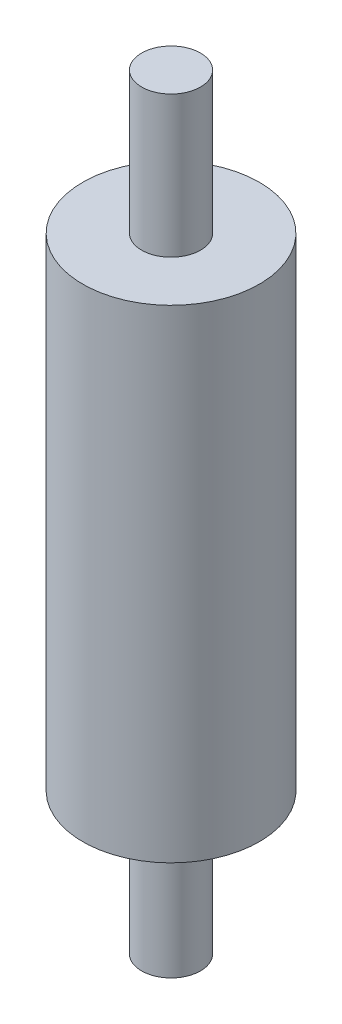
ISO-10303-21;
HEADER;
FILE_DESCRIPTION(('STEP AP214'),'2;1');
FILE_NAME('part.step','',(''),(''),'','','');
FILE_SCHEMA(('AUTOMOTIVE_DESIGN { 1 0 10303 214 1 1 1 1 }'));
ENDSEC;
DATA;
#1=APPLICATION_CONTEXT('core data for automotive mechanical design processes');
#2=APPLICATION_PROTOCOL_DEFINITION('international standard','automotive_design',2000,#1);
#3=PRODUCT_CONTEXT('',#1,'mechanical');
#4=PRODUCT('Part','Part','',(#3));
#5=PRODUCT_RELATED_PRODUCT_CATEGORY('part','',(#4));
#6=PRODUCT_DEFINITION_FORMATION('','',#4);
#7=PRODUCT_DEFINITION_CONTEXT('part definition',#1,'design');
#8=PRODUCT_DEFINITION('design','',#6,#7);
#9=PRODUCT_DEFINITION_SHAPE('','',#8);
#10=(LENGTH_UNIT() NAMED_UNIT(*) SI_UNIT(.MILLI.,.METRE.));
#11=(NAMED_UNIT(*) PLANE_ANGLE_UNIT() SI_UNIT($,.RADIAN.));
#12=(NAMED_UNIT(*) SI_UNIT($,.STERADIAN.) SOLID_ANGLE_UNIT());
#13=UNCERTAINTY_MEASURE_WITH_UNIT(LENGTH_MEASURE(1.E-05),#10,'distance_accuracy_value','');
#14=(GEOMETRIC_REPRESENTATION_CONTEXT(3) GLOBAL_UNCERTAINTY_ASSIGNED_CONTEXT((#13)) GLOBAL_UNIT_ASSIGNED_CONTEXT((#10,
#11,#12)) REPRESENTATION_CONTEXT('',''));
#15=CARTESIAN_POINT('',(0.,0.,0.));
#16=DIRECTION('',(0.,0.,1.));
#17=DIRECTION('',(1.,0.,0.));
#18=AXIS2_PLACEMENT_3D('',#15,#16,#17);
#19=CARTESIAN_POINT('',(0.,-32.5,0.));
#20=DIRECTION('',(0.,-1.,0.));
#21=DIRECTION('',(0.,0.,-1.));
#22=AXIS2_PLACEMENT_3D('',#19,#20,#21);
#23=PLANE('',#22);
#24=CARTESIAN_POINT('',(0.,-32.5,0.));
#25=DIRECTION('',(0.,-1.,0.));
#26=DIRECTION('',(0.,0.,-1.));
#27=AXIS2_PLACEMENT_3D('',#24,#25,#26);
#28=CIRCLE('',#27,2.5);
#29=CARTESIAN_POINT('',(0.,-32.5,-2.5));
#30=VERTEX_POINT('',#29);
#31=EDGE_CURVE('E10',#30,#30,#28,.T.);
#32=ORIENTED_EDGE('',*,*,#31,.T.);
#33=EDGE_LOOP('',(#32));
#34=FACE_BOUND('',#33,.T.);
#35=ADVANCED_FACE('F35',(#34),#23,.T.);
#36=CARTESIAN_POINT('',(0.,0.,0.));
#37=DIRECTION('',(0.,-1.,0.));
#38=DIRECTION('',(0.,0.,-1.));
#39=AXIS2_PLACEMENT_3D('',#36,#37,#38);
#40=CYLINDRICAL_SURFACE('',#39,2.5);
#41=CARTESIAN_POINT('',(0.,-20.5,0.));
#42=DIRECTION('',(0.,-1.,0.));
#43=DIRECTION('',(0.,0.,-1.));
#44=AXIS2_PLACEMENT_3D('',#41,#42,#43);
#45=CIRCLE('',#44,2.5);
#46=CARTESIAN_POINT('',(0.,-20.5,-2.5));
#47=VERTEX_POINT('',#46);
#48=EDGE_CURVE('E41',#47,#47,#45,.T.);
#49=ORIENTED_EDGE('',*,*,#48,.T.);
#50=EDGE_LOOP('',(#49));
#51=FACE_BOUND('',#50,.T.);
#52=ORIENTED_EDGE('',*,*,#31,.F.);
#53=EDGE_LOOP('',(#52));
#54=FACE_BOUND('',#53,.T.);
#55=ADVANCED_FACE('F73',(#51,#54),#40,.T.);
#56=CARTESIAN_POINT('',(0.,-20.5,-2.5));
#57=DIRECTION('',(0.,-1.,0.));
#58=DIRECTION('',(0.,0.,-1.));
#59=AXIS2_PLACEMENT_3D('',#56,#57,#58);
#60=PLANE('',#59);
#61=CARTESIAN_POINT('',(0.,-20.5,0.));
#62=DIRECTION('',(0.,-1.,0.));
#63=DIRECTION('',(0.,0.,-1.));
#64=AXIS2_PLACEMENT_3D('',#61,#62,#63);
#65=CIRCLE('',#64,7.5);
#66=CARTESIAN_POINT('',(0.,-20.5,-7.5));
#67=VERTEX_POINT('',#66);
#68=EDGE_CURVE('E45',#67,#67,#65,.T.);
#69=ORIENTED_EDGE('',*,*,#68,.T.);
#70=EDGE_LOOP('',(#69));
#71=FACE_BOUND('',#70,.T.);
#72=ORIENTED_EDGE('',*,*,#48,.F.);
#73=EDGE_LOOP('',(#72));
#74=FACE_BOUND('',#73,.T.);
#75=ADVANCED_FACE('F77',(#71,#74),#60,.T.);
#76=CARTESIAN_POINT('',(0.,0.,0.));
#77=DIRECTION('',(0.,-1.,0.));
#78=DIRECTION('',(0.,0.,-1.));
#79=AXIS2_PLACEMENT_3D('',#76,#77,#78);
#80=CYLINDRICAL_SURFACE('',#79,7.5);
#81=CARTESIAN_POINT('',(0.,20.5,0.));
#82=DIRECTION('',(0.,-1.,0.));
#83=DIRECTION('',(0.,0.,-1.));
#84=AXIS2_PLACEMENT_3D('',#81,#82,#83);
#85=CIRCLE('',#84,7.5);
#86=CARTESIAN_POINT('',(0.,20.5,-7.5));
#87=VERTEX_POINT('',#86);
#88=EDGE_CURVE('E49',#87,#87,#85,.T.);
#89=ORIENTED_EDGE('',*,*,#88,.T.);
#90=EDGE_LOOP('',(#89));
#91=FACE_BOUND('',#90,.T.);
#92=ORIENTED_EDGE('',*,*,#68,.F.);
#93=EDGE_LOOP('',(#92));
#94=FACE_BOUND('',#93,.T.);
#95=ADVANCED_FACE('F81',(#91,#94),#80,.T.);
#96=CARTESIAN_POINT('',(0.,20.5,-7.5));
#97=DIRECTION('',(0.,1.,0.));
#98=DIRECTION('',(0.,0.,1.));
#99=AXIS2_PLACEMENT_3D('',#96,#97,#98);
#100=PLANE('',#99);
#101=CARTESIAN_POINT('',(0.,20.5,0.));
#102=DIRECTION('',(0.,-1.,0.));
#103=DIRECTION('',(0.,0.,-1.));
#104=AXIS2_PLACEMENT_3D('',#101,#102,#103);
#105=CIRCLE('',#104,2.5);
#106=CARTESIAN_POINT('',(0.,20.5,-2.5));
#107=VERTEX_POINT('',#106);
#108=EDGE_CURVE('E54',#107,#107,#105,.T.);
#109=ORIENTED_EDGE('',*,*,#108,.T.);
#110=EDGE_LOOP('',(#109));
#111=FACE_BOUND('',#110,.T.);
#112=ORIENTED_EDGE('',*,*,#88,.F.);
#113=EDGE_LOOP('',(#112));
#114=FACE_BOUND('',#113,.T.);
#115=ADVANCED_FACE('F70',(#111,#114),#100,.T.);
#116=CARTESIAN_POINT('',(0.,0.,0.));
#117=DIRECTION('',(0.,-1.,0.));
#118=DIRECTION('',(0.,0.,-1.));
#119=AXIS2_PLACEMENT_3D('',#116,#117,#118);
#120=CYLINDRICAL_SURFACE('',#119,2.5);
#121=CARTESIAN_POINT('',(0.,32.5,0.));
#122=DIRECTION('',(0.,-1.,0.));
#123=DIRECTION('',(0.,0.,-1.));
#124=AXIS2_PLACEMENT_3D('',#121,#122,#123);
#125=CIRCLE('',#124,2.5);
#126=CARTESIAN_POINT('',(0.,32.5,-2.5));
#127=VERTEX_POINT('',#126);
#128=EDGE_CURVE('E57',#127,#127,#125,.T.);
#129=ORIENTED_EDGE('',*,*,#128,.T.);
#130=EDGE_LOOP('',(#129));
#131=FACE_BOUND('',#130,.T.);
#132=ORIENTED_EDGE('',*,*,#108,.F.);
#133=EDGE_LOOP('',(#132));
#134=FACE_BOUND('',#133,.T.);
#135=ADVANCED_FACE('F61',(#131,#134),#120,.T.);
#136=CARTESIAN_POINT('',(0.,32.5,-2.5));
#137=DIRECTION('',(0.,1.,0.));
#138=DIRECTION('',(0.,0.,1.));
#139=AXIS2_PLACEMENT_3D('',#136,#137,#138);
#140=PLANE('',#139);
#141=ORIENTED_EDGE('',*,*,#128,.F.);
#142=EDGE_LOOP('',(#141));
#143=FACE_BOUND('',#142,.T.);
#144=ADVANCED_FACE('F64',(#143),#140,.T.);
#145=CLOSED_SHELL('',(#35,#55,#75,#95,#115,#135,#144));
#146=MANIFOLD_SOLID_BREP('B2',#145);
#147=ADVANCED_BREP_SHAPE_REPRESENTATION('',(#18,#146),#14);
#148=SHAPE_DEFINITION_REPRESENTATION(#9,#147);
ENDSEC;
END-ISO-10303-21;
